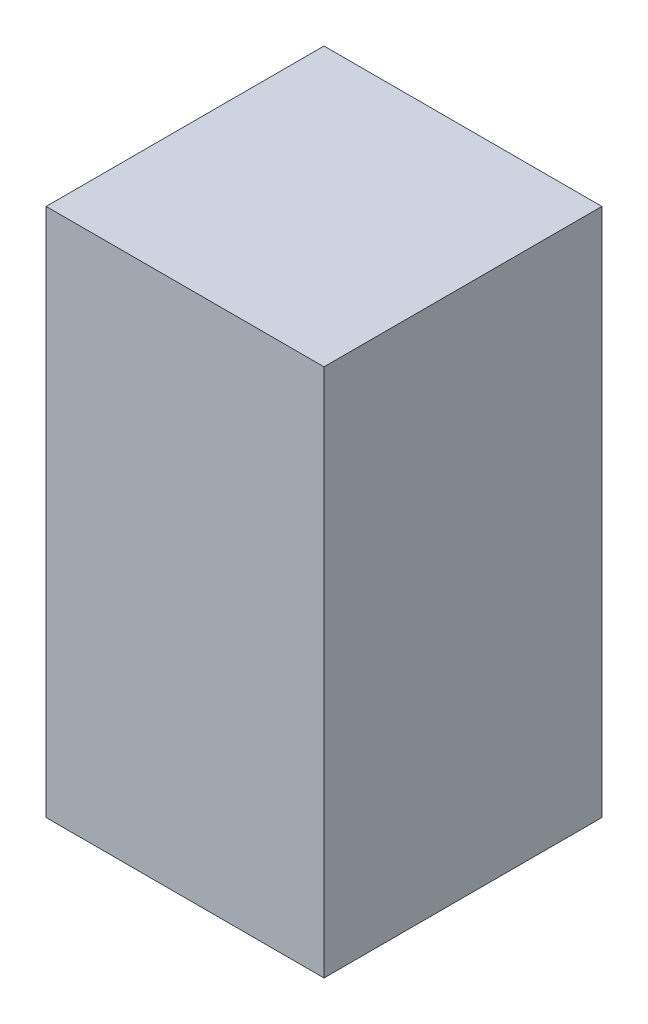
ISO-10303-21;
HEADER;
FILE_DESCRIPTION(('STEP AP214'),'2;1');
FILE_NAME('part.step','',(''),(''),'','','');
FILE_SCHEMA(('AUTOMOTIVE_DESIGN { 1 0 10303 214 1 1 1 1 }'));
ENDSEC;
DATA;
#1=APPLICATION_CONTEXT('core data for automotive mechanical design processes');
#2=APPLICATION_PROTOCOL_DEFINITION('international standard','automotive_design',2000,#1);
#3=PRODUCT_CONTEXT('',#1,'mechanical');
#4=PRODUCT('Part','Part','',(#3));
#5=PRODUCT_RELATED_PRODUCT_CATEGORY('part','',(#4));
#6=PRODUCT_DEFINITION_FORMATION('','',#4);
#7=PRODUCT_DEFINITION_CONTEXT('part definition',#1,'design');
#8=PRODUCT_DEFINITION('design','',#6,#7);
#9=PRODUCT_DEFINITION_SHAPE('','',#8);
#10=(LENGTH_UNIT() NAMED_UNIT(*) SI_UNIT(.MILLI.,.METRE.));
#11=(NAMED_UNIT(*) PLANE_ANGLE_UNIT() SI_UNIT($,.RADIAN.));
#12=(NAMED_UNIT(*) SI_UNIT($,.STERADIAN.) SOLID_ANGLE_UNIT());
#13=UNCERTAINTY_MEASURE_WITH_UNIT(LENGTH_MEASURE(1.E-05),#10,'distance_accuracy_value','');
#14=(GEOMETRIC_REPRESENTATION_CONTEXT(3) GLOBAL_UNCERTAINTY_ASSIGNED_CONTEXT((#13)) GLOBAL_UNIT_ASSIGNED_CONTEXT((#10,
#11,#12)) REPRESENTATION_CONTEXT('',''));
#15=CARTESIAN_POINT('',(0.,0.,0.));
#16=DIRECTION('',(0.,0.,1.));
#17=DIRECTION('',(1.,0.,0.));
#18=AXIS2_PLACEMENT_3D('',#15,#16,#17);
#19=CARTESIAN_POINT('',(-80.,304.8,0.));
#20=DIRECTION('',(1.,0.,0.));
#21=DIRECTION('',(0.,0.,-1.));
#22=AXIS2_PLACEMENT_3D('',#19,#20,#21);
#23=PLANE('',#22);
#24=DIRECTION('',(0.,0.,1.));
#25=VECTOR('',#24,1.);
#26=CARTESIAN_POINT('',(-80.,0.,0.));
#27=LINE('',#26,#25);
#28=CARTESIAN_POINT('',(-80.,0.,-80.));
#29=VERTEX_POINT('',#28);
#30=CARTESIAN_POINT('',(-80.,0.,80.));
#31=VERTEX_POINT('',#30);
#32=EDGE_CURVE('E79',#29,#31,#27,.T.);
#33=ORIENTED_EDGE('',*,*,#32,.T.);
#34=DIRECTION('',(0.,-1.,0.));
#35=VECTOR('',#34,1.);
#36=CARTESIAN_POINT('',(-80.,304.8,80.));
#37=LINE('',#36,#35);
#38=CARTESIAN_POINT('',(-80.,304.8,80.));
#39=VERTEX_POINT('',#38);
#40=EDGE_CURVE('E11',#39,#31,#37,.T.);
#41=ORIENTED_EDGE('',*,*,#40,.F.);
#42=DIRECTION('',(0.,0.,1.));
#43=VECTOR('',#42,1.);
#44=CARTESIAN_POINT('',(-80.,304.8,-80.));
#45=LINE('',#44,#43);
#46=CARTESIAN_POINT('',(-80.,304.8,-80.));
#47=VERTEX_POINT('',#46);
#48=EDGE_CURVE('E83',#47,#39,#45,.T.);
#49=ORIENTED_EDGE('',*,*,#48,.F.);
#50=DIRECTION('',(0.,-1.,0.));
#51=VECTOR('',#50,1.);
#52=CARTESIAN_POINT('',(-80.,304.8,-80.));
#53=LINE('',#52,#51);
#54=EDGE_CURVE('E103',#47,#29,#53,.T.);
#55=ORIENTED_EDGE('',*,*,#54,.T.);
#56=EDGE_LOOP('',(#33,#41,#49,#55));
#57=FACE_BOUND('',#56,.T.);
#58=ADVANCED_FACE('F43',(#57),#23,.F.);
#59=CARTESIAN_POINT('',(80.,304.8,80.));
#60=DIRECTION('',(0.,0.,1.));
#61=DIRECTION('',(1.,0.,0.));
#62=AXIS2_PLACEMENT_3D('',#59,#60,#61);
#63=PLANE('',#62);
#64=DIRECTION('',(-1.,0.,0.));
#65=VECTOR('',#64,1.);
#66=CARTESIAN_POINT('',(80.,0.,80.));
#67=LINE('',#66,#65);
#68=CARTESIAN_POINT('',(80.,0.,80.));
#69=VERTEX_POINT('',#68);
#70=EDGE_CURVE('E97',#69,#31,#67,.T.);
#71=ORIENTED_EDGE('',*,*,#70,.F.);
#72=DIRECTION('',(0.,-1.,0.));
#73=VECTOR('',#72,1.);
#74=CARTESIAN_POINT('',(80.,304.8,80.));
#75=LINE('',#74,#73);
#76=CARTESIAN_POINT('',(80.,304.8,80.));
#77=VERTEX_POINT('',#76);
#78=EDGE_CURVE('E51',#77,#69,#75,.T.);
#79=ORIENTED_EDGE('',*,*,#78,.F.);
#80=DIRECTION('',(1.,0.,0.));
#81=VECTOR('',#80,1.);
#82=CARTESIAN_POINT('',(-80.,304.8,80.));
#83=LINE('',#82,#81);
#84=EDGE_CURVE('E86',#39,#77,#83,.T.);
#85=ORIENTED_EDGE('',*,*,#84,.F.);
#86=ORIENTED_EDGE('',*,*,#40,.T.);
#87=EDGE_LOOP('',(#71,#79,#85,#86));
#88=FACE_BOUND('',#87,.T.);
#89=ADVANCED_FACE('F96',(#88),#63,.T.);
#90=CARTESIAN_POINT('',(80.,304.8,0.));
#91=DIRECTION('',(-1.,0.,0.));
#92=DIRECTION('',(0.,0.,1.));
#93=AXIS2_PLACEMENT_3D('',#90,#91,#92);
#94=PLANE('',#93);
#95=DIRECTION('',(0.,0.,-1.));
#96=VECTOR('',#95,1.);
#97=CARTESIAN_POINT('',(80.,0.,0.));
#98=LINE('',#97,#96);
#99=CARTESIAN_POINT('',(80.,0.,-80.));
#100=VERTEX_POINT('',#99);
#101=EDGE_CURVE('E109',#69,#100,#98,.T.);
#102=ORIENTED_EDGE('',*,*,#101,.T.);
#103=DIRECTION('',(0.,-1.,0.));
#104=VECTOR('',#103,1.);
#105=CARTESIAN_POINT('',(80.,304.8,-80.));
#106=LINE('',#105,#104);
#107=CARTESIAN_POINT('',(80.,304.8,-80.));
#108=VERTEX_POINT('',#107);
#109=EDGE_CURVE('E99',#108,#100,#106,.T.);
#110=ORIENTED_EDGE('',*,*,#109,.F.);
#111=DIRECTION('',(0.,0.,1.));
#112=VECTOR('',#111,1.);
#113=CARTESIAN_POINT('',(80.,304.8,0.));
#114=LINE('',#113,#112);
#115=EDGE_CURVE('E90',#108,#77,#114,.T.);
#116=ORIENTED_EDGE('',*,*,#115,.T.);
#117=ORIENTED_EDGE('',*,*,#78,.T.);
#118=EDGE_LOOP('',(#102,#110,#116,#117));
#119=FACE_BOUND('',#118,.T.);
#120=ADVANCED_FACE('F100',(#119),#94,.F.);
#121=CARTESIAN_POINT('',(0.,304.8,-80.));
#122=DIRECTION('',(0.,0.,1.));
#123=DIRECTION('',(1.,0.,0.));
#124=AXIS2_PLACEMENT_3D('',#121,#122,#123);
#125=PLANE('',#124);
#126=DIRECTION('',(-1.,0.,0.));
#127=VECTOR('',#126,1.);
#128=CARTESIAN_POINT('',(0.,0.,-80.));
#129=LINE('',#128,#127);
#130=EDGE_CURVE('E75',#100,#29,#129,.T.);
#131=ORIENTED_EDGE('',*,*,#130,.T.);
#132=ORIENTED_EDGE('',*,*,#54,.F.);
#133=DIRECTION('',(-1.,0.,0.));
#134=VECTOR('',#133,1.);
#135=CARTESIAN_POINT('',(80.,304.8,-80.));
#136=LINE('',#135,#134);
#137=EDGE_CURVE('E59',#108,#47,#136,.T.);
#138=ORIENTED_EDGE('',*,*,#137,.F.);
#139=ORIENTED_EDGE('',*,*,#109,.T.);
#140=EDGE_LOOP('',(#131,#132,#138,#139));
#141=FACE_BOUND('',#140,.T.);
#142=ADVANCED_FACE('F115',(#141),#125,.F.);
#143=CARTESIAN_POINT('',(0.,304.8,0.));
#144=DIRECTION('',(0.,1.,0.));
#145=DIRECTION('',(0.,0.,1.));
#146=AXIS2_PLACEMENT_3D('',#143,#144,#145);
#147=PLANE('',#146);
#148=ORIENTED_EDGE('',*,*,#48,.T.);
#149=ORIENTED_EDGE('',*,*,#84,.T.);
#150=ORIENTED_EDGE('',*,*,#115,.F.);
#151=ORIENTED_EDGE('',*,*,#137,.T.);
#152=EDGE_LOOP('',(#148,#149,#150,#151));
#153=FACE_BOUND('',#152,.T.);
#154=ADVANCED_FACE('F88',(#153),#147,.T.);
#155=CARTESIAN_POINT('',(0.,0.,0.));
#156=DIRECTION('',(0.,1.,0.));
#157=DIRECTION('',(0.,0.,1.));
#158=AXIS2_PLACEMENT_3D('',#155,#156,#157);
#159=PLANE('',#158);
#160=ORIENTED_EDGE('',*,*,#32,.F.);
#161=ORIENTED_EDGE('',*,*,#130,.F.);
#162=ORIENTED_EDGE('',*,*,#101,.F.);
#163=ORIENTED_EDGE('',*,*,#70,.T.);
#164=EDGE_LOOP('',(#160,#161,#162,#163));
#165=FACE_BOUND('',#164,.T.);
#166=ADVANCED_FACE('F128',(#165),#159,.F.);
#167=CLOSED_SHELL('',(#58,#89,#120,#142,#154,#166));
#168=MANIFOLD_SOLID_BREP('B2',#167);
#169=ADVANCED_BREP_SHAPE_REPRESENTATION('',(#18,#168),#14);
#170=SHAPE_DEFINITION_REPRESENTATION(#9,#169);
ENDSEC;
END-ISO-10303-21;
